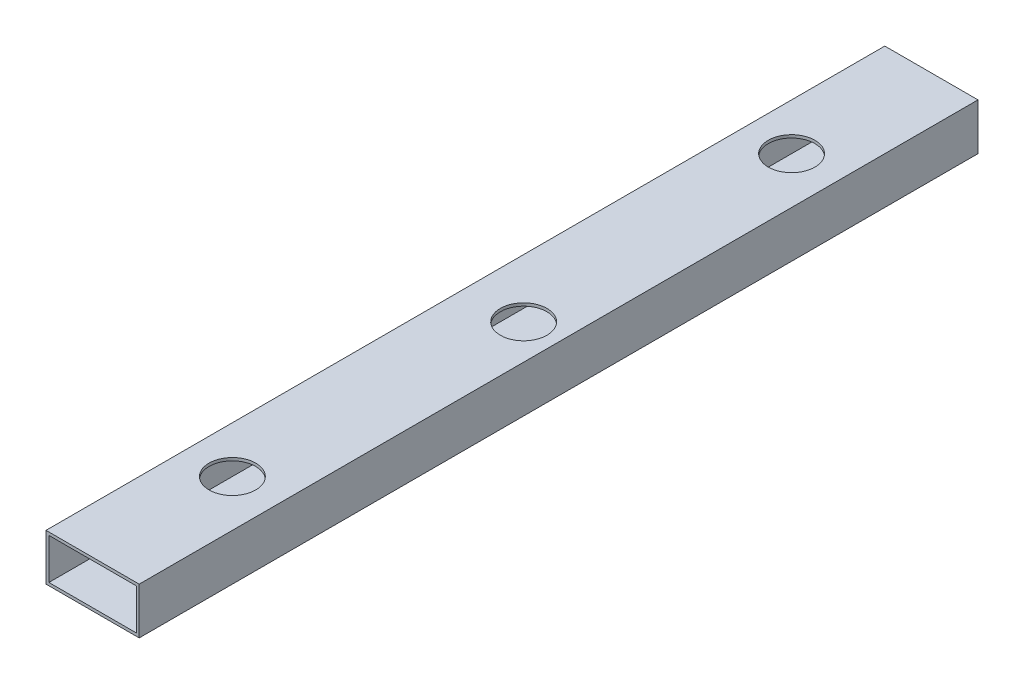
ISO-10303-21;
HEADER;
FILE_DESCRIPTION(('STEP AP214'),'2;1');
FILE_NAME('part.step','',(''),(''),'','','');
FILE_SCHEMA(('AUTOMOTIVE_DESIGN { 1 0 10303 214 1 1 1 1 }'));
ENDSEC;
DATA;
#1=APPLICATION_CONTEXT('core data for automotive mechanical design processes');
#2=APPLICATION_PROTOCOL_DEFINITION('international standard','automotive_design',2000,#1);
#3=PRODUCT_CONTEXT('',#1,'mechanical');
#4=PRODUCT('Part','Part','',(#3));
#5=PRODUCT_RELATED_PRODUCT_CATEGORY('part','',(#4));
#6=PRODUCT_DEFINITION_FORMATION('','',#4);
#7=PRODUCT_DEFINITION_CONTEXT('part definition',#1,'design');
#8=PRODUCT_DEFINITION('design','',#6,#7);
#9=PRODUCT_DEFINITION_SHAPE('','',#8);
#10=(LENGTH_UNIT() NAMED_UNIT(*) SI_UNIT(.MILLI.,.METRE.));
#11=(NAMED_UNIT(*) PLANE_ANGLE_UNIT() SI_UNIT($,.RADIAN.));
#12=(NAMED_UNIT(*) SI_UNIT($,.STERADIAN.) SOLID_ANGLE_UNIT());
#13=UNCERTAINTY_MEASURE_WITH_UNIT(LENGTH_MEASURE(1.E-05),#10,'distance_accuracy_value','');
#14=(GEOMETRIC_REPRESENTATION_CONTEXT(3) GLOBAL_UNCERTAINTY_ASSIGNED_CONTEXT((#13)) GLOBAL_UNIT_ASSIGNED_CONTEXT((#10,
#11,#12)) REPRESENTATION_CONTEXT('',''));
#15=CARTESIAN_POINT('',(0.,0.,0.));
#16=DIRECTION('',(0.,0.,1.));
#17=DIRECTION('',(1.,0.,0.));
#18=AXIS2_PLACEMENT_3D('',#15,#16,#17);
#19=CARTESIAN_POINT('',(0.,0.,457.2));
#20=DIRECTION('',(0.,0.,-1.));
#21=DIRECTION('',(-1.,0.,0.));
#22=AXIS2_PLACEMENT_3D('',#19,#20,#21);
#23=PLANE('',#22);
#24=DIRECTION('',(0.,-1.,0.));
#25=VECTOR('',#24,1.);
#26=CARTESIAN_POINT('',(0.,0.,457.2));
#27=LINE('',#26,#25);
#28=CARTESIAN_POINT('',(0.,25.4,457.2));
#29=VERTEX_POINT('',#28);
#30=CARTESIAN_POINT('',(0.,0.,457.2));
#31=VERTEX_POINT('',#30);
#32=EDGE_CURVE('E138',#29,#31,#27,.T.);
#33=ORIENTED_EDGE('',*,*,#32,.T.);
#34=DIRECTION('',(1.,0.,0.));
#35=VECTOR('',#34,1.);
#36=CARTESIAN_POINT('',(0.,0.,457.2));
#37=LINE('',#36,#35);
#38=CARTESIAN_POINT('',(50.8,0.,457.2));
#39=VERTEX_POINT('',#38);
#40=EDGE_CURVE('E141',#31,#39,#37,.T.);
#41=ORIENTED_EDGE('',*,*,#40,.T.);
#42=DIRECTION('',(0.,1.,0.));
#43=VECTOR('',#42,1.);
#44=CARTESIAN_POINT('',(50.8,0.,457.2));
#45=LINE('',#44,#43);
#46=CARTESIAN_POINT('',(50.8,25.4,457.2));
#47=VERTEX_POINT('',#46);
#48=EDGE_CURVE('E144',#39,#47,#45,.T.);
#49=ORIENTED_EDGE('',*,*,#48,.T.);
#50=DIRECTION('',(-1.,0.,0.));
#51=VECTOR('',#50,1.);
#52=CARTESIAN_POINT('',(0.,25.4,457.2));
#53=LINE('',#52,#51);
#54=EDGE_CURVE('E146',#47,#29,#53,.T.);
#55=ORIENTED_EDGE('',*,*,#54,.T.);
#56=EDGE_LOOP('',(#33,#41,#49,#55));
#57=FACE_BOUND('',#56,.T.);
#58=DIRECTION('',(0.,-1.,0.));
#59=VECTOR('',#58,1.);
#60=CARTESIAN_POINT('',(1.5875,1.5875,457.2));
#61=LINE('',#60,#59);
#62=CARTESIAN_POINT('',(1.5875,23.8125,457.2));
#63=VERTEX_POINT('',#62);
#64=CARTESIAN_POINT('',(1.5875,1.5875,457.2));
#65=VERTEX_POINT('',#64);
#66=EDGE_CURVE('E100',#63,#65,#61,.T.);
#67=ORIENTED_EDGE('',*,*,#66,.F.);
#68=DIRECTION('',(-1.,0.,0.));
#69=VECTOR('',#68,1.);
#70=CARTESIAN_POINT('',(1.5875,23.8125,457.2));
#71=LINE('',#70,#69);
#72=CARTESIAN_POINT('',(49.2125,23.8125,457.2));
#73=VERTEX_POINT('',#72);
#74=EDGE_CURVE('E122',#73,#63,#71,.T.);
#75=ORIENTED_EDGE('',*,*,#74,.F.);
#76=DIRECTION('',(0.,1.,0.));
#77=VECTOR('',#76,1.);
#78=CARTESIAN_POINT('',(49.2125,1.5875,457.2));
#79=LINE('',#78,#77);
#80=CARTESIAN_POINT('',(49.2125,1.5875,457.2));
#81=VERTEX_POINT('',#80);
#82=EDGE_CURVE('E120',#81,#73,#79,.T.);
#83=ORIENTED_EDGE('',*,*,#82,.F.);
#84=DIRECTION('',(1.,0.,0.));
#85=VECTOR('',#84,1.);
#86=CARTESIAN_POINT('',(1.5875,1.5875,457.2));
#87=LINE('',#86,#85);
#88=EDGE_CURVE('E108',#65,#81,#87,.T.);
#89=ORIENTED_EDGE('',*,*,#88,.F.);
#90=EDGE_LOOP('',(#67,#75,#83,#89));
#91=FACE_BOUND('',#90,.T.);
#92=ADVANCED_FACE('F33',(#57,#91),#23,.F.);
#93=CARTESIAN_POINT('',(0.,0.,0.));
#94=DIRECTION('',(0.,0.,-1.));
#95=DIRECTION('',(-1.,0.,0.));
#96=AXIS2_PLACEMENT_3D('',#93,#94,#95);
#97=PLANE('',#96);
#98=DIRECTION('',(0.,-1.,0.));
#99=VECTOR('',#98,1.);
#100=CARTESIAN_POINT('',(0.,0.,0.));
#101=LINE('',#100,#99);
#102=CARTESIAN_POINT('',(0.,25.4,0.));
#103=VERTEX_POINT('',#102);
#104=CARTESIAN_POINT('',(0.,0.,0.));
#105=VERTEX_POINT('',#104);
#106=EDGE_CURVE('E116',#103,#105,#101,.T.);
#107=ORIENTED_EDGE('',*,*,#106,.F.);
#108=DIRECTION('',(-1.,0.,0.));
#109=VECTOR('',#108,1.);
#110=CARTESIAN_POINT('',(0.,25.4,0.));
#111=LINE('',#110,#109);
#112=CARTESIAN_POINT('',(50.8,25.4,0.));
#113=VERTEX_POINT('',#112);
#114=EDGE_CURVE('E142',#113,#103,#111,.T.);
#115=ORIENTED_EDGE('',*,*,#114,.F.);
#116=DIRECTION('',(0.,1.,0.));
#117=VECTOR('',#116,1.);
#118=CARTESIAN_POINT('',(50.8,0.,0.));
#119=LINE('',#118,#117);
#120=CARTESIAN_POINT('',(50.8,0.,0.));
#121=VERTEX_POINT('',#120);
#122=EDGE_CURVE('E153',#121,#113,#119,.T.);
#123=ORIENTED_EDGE('',*,*,#122,.F.);
#124=DIRECTION('',(1.,0.,0.));
#125=VECTOR('',#124,1.);
#126=CARTESIAN_POINT('',(0.,0.,0.));
#127=LINE('',#126,#125);
#128=EDGE_CURVE('E151',#105,#121,#127,.T.);
#129=ORIENTED_EDGE('',*,*,#128,.F.);
#130=EDGE_LOOP('',(#107,#115,#123,#129));
#131=FACE_BOUND('',#130,.T.);
#132=DIRECTION('',(-1.,0.,0.));
#133=VECTOR('',#132,1.);
#134=CARTESIAN_POINT('',(1.5875,23.8125,0.));
#135=LINE('',#134,#133);
#136=CARTESIAN_POINT('',(49.2125,23.8125,0.));
#137=VERTEX_POINT('',#136);
#138=CARTESIAN_POINT('',(1.5875,23.8125,0.));
#139=VERTEX_POINT('',#138);
#140=EDGE_CURVE('E109',#137,#139,#135,.T.);
#141=ORIENTED_EDGE('',*,*,#140,.T.);
#142=DIRECTION('',(0.,-1.,0.));
#143=VECTOR('',#142,1.);
#144=CARTESIAN_POINT('',(1.5875,1.5875,0.));
#145=LINE('',#144,#143);
#146=CARTESIAN_POINT('',(1.5875,1.5875,0.));
#147=VERTEX_POINT('',#146);
#148=EDGE_CURVE('E58',#139,#147,#145,.T.);
#149=ORIENTED_EDGE('',*,*,#148,.T.);
#150=DIRECTION('',(1.,0.,0.));
#151=VECTOR('',#150,1.);
#152=CARTESIAN_POINT('',(1.5875,1.5875,0.));
#153=LINE('',#152,#151);
#154=CARTESIAN_POINT('',(49.2125,1.5875,0.));
#155=VERTEX_POINT('',#154);
#156=EDGE_CURVE('E115',#147,#155,#153,.T.);
#157=ORIENTED_EDGE('',*,*,#156,.T.);
#158=DIRECTION('',(0.,1.,0.));
#159=VECTOR('',#158,1.);
#160=CARTESIAN_POINT('',(49.2125,1.5875,0.));
#161=LINE('',#160,#159);
#162=EDGE_CURVE('E130',#155,#137,#161,.T.);
#163=ORIENTED_EDGE('',*,*,#162,.T.);
#164=EDGE_LOOP('',(#141,#149,#157,#163));
#165=FACE_BOUND('',#164,.T.);
#166=ADVANCED_FACE('F213',(#131,#165),#97,.T.);
#167=CARTESIAN_POINT('',(0.,0.,457.2));
#168=DIRECTION('',(1.,0.,0.));
#169=DIRECTION('',(0.,0.,-1.));
#170=AXIS2_PLACEMENT_3D('',#167,#168,#169);
#171=PLANE('',#170);
#172=ORIENTED_EDGE('',*,*,#106,.T.);
#173=DIRECTION('',(0.,0.,-1.));
#174=VECTOR('',#173,1.);
#175=CARTESIAN_POINT('',(0.,0.,457.2));
#176=LINE('',#175,#174);
#177=EDGE_CURVE('E11',#31,#105,#176,.T.);
#178=ORIENTED_EDGE('',*,*,#177,.F.);
#179=ORIENTED_EDGE('',*,*,#32,.F.);
#180=DIRECTION('',(0.,0.,-1.));
#181=VECTOR('',#180,1.);
#182=CARTESIAN_POINT('',(0.,25.4,457.2));
#183=LINE('',#182,#181);
#184=EDGE_CURVE('E148',#29,#103,#183,.T.);
#185=ORIENTED_EDGE('',*,*,#184,.T.);
#186=EDGE_LOOP('',(#172,#178,#179,#185));
#187=FACE_BOUND('',#186,.T.);
#188=ADVANCED_FACE('F35',(#187),#171,.F.);
#189=CARTESIAN_POINT('',(0.,0.,457.2));
#190=DIRECTION('',(0.,1.,0.));
#191=DIRECTION('',(0.,0.,1.));
#192=AXIS2_PLACEMENT_3D('',#189,#190,#191);
#193=PLANE('',#192);
#194=CARTESIAN_POINT('',(31.75,0.,228.6));
#195=DIRECTION('',(0.,1.,0.));
#196=DIRECTION('',(0.,0.,1.));
#197=AXIS2_PLACEMENT_3D('',#194,#195,#196);
#198=CIRCLE('',#197,12.7);
#199=CARTESIAN_POINT('',(31.75,0.,241.3));
#200=VERTEX_POINT('',#199);
#201=EDGE_CURVE('E237',#200,#200,#198,.T.);
#202=ORIENTED_EDGE('',*,*,#201,.T.);
#203=EDGE_LOOP('',(#202));
#204=FACE_BOUND('',#203,.T.);
#205=CARTESIAN_POINT('',(25.4,0.,76.2));
#206=DIRECTION('',(0.,1.,0.));
#207=DIRECTION('',(0.,0.,1.));
#208=AXIS2_PLACEMENT_3D('',#205,#206,#207);
#209=CIRCLE('',#208,12.7);
#210=CARTESIAN_POINT('',(25.4,0.,88.9));
#211=VERTEX_POINT('',#210);
#212=EDGE_CURVE('E169',#211,#211,#209,.T.);
#213=ORIENTED_EDGE('',*,*,#212,.T.);
#214=EDGE_LOOP('',(#213));
#215=FACE_BOUND('',#214,.T.);
#216=CARTESIAN_POINT('',(25.4,0.,381.));
#217=DIRECTION('',(0.,1.,0.));
#218=DIRECTION('',(0.,0.,1.));
#219=AXIS2_PLACEMENT_3D('',#216,#217,#218);
#220=CIRCLE('',#219,12.7);
#221=CARTESIAN_POINT('',(25.4,0.,393.7));
#222=VERTEX_POINT('',#221);
#223=EDGE_CURVE('E165',#222,#222,#220,.T.);
#224=ORIENTED_EDGE('',*,*,#223,.T.);
#225=EDGE_LOOP('',(#224));
#226=FACE_BOUND('',#225,.T.);
#227=ORIENTED_EDGE('',*,*,#128,.T.);
#228=DIRECTION('',(0.,0.,-1.));
#229=VECTOR('',#228,1.);
#230=CARTESIAN_POINT('',(50.8,0.,457.2));
#231=LINE('',#230,#229);
#232=EDGE_CURVE('E42',#39,#121,#231,.T.);
#233=ORIENTED_EDGE('',*,*,#232,.F.);
#234=ORIENTED_EDGE('',*,*,#40,.F.);
#235=ORIENTED_EDGE('',*,*,#177,.T.);
#236=EDGE_LOOP('',(#227,#233,#234,#235));
#237=FACE_BOUND('',#236,.T.);
#238=ADVANCED_FACE('F226',(#204,#215,#226,#237),#193,.F.);
#239=CARTESIAN_POINT('',(50.8,0.,457.2));
#240=DIRECTION('',(-1.,0.,0.));
#241=DIRECTION('',(0.,0.,1.));
#242=AXIS2_PLACEMENT_3D('',#239,#240,#241);
#243=PLANE('',#242);
#244=ORIENTED_EDGE('',*,*,#122,.T.);
#245=DIRECTION('',(0.,0.,-1.));
#246=VECTOR('',#245,1.);
#247=CARTESIAN_POINT('',(50.8,25.4,457.2));
#248=LINE('',#247,#246);
#249=EDGE_CURVE('E158',#47,#113,#248,.T.);
#250=ORIENTED_EDGE('',*,*,#249,.F.);
#251=ORIENTED_EDGE('',*,*,#48,.F.);
#252=ORIENTED_EDGE('',*,*,#232,.T.);
#253=EDGE_LOOP('',(#244,#250,#251,#252));
#254=FACE_BOUND('',#253,.T.);
#255=ADVANCED_FACE('F223',(#254),#243,.F.);
#256=CARTESIAN_POINT('',(0.,25.4,457.2));
#257=DIRECTION('',(0.,-1.,0.));
#258=DIRECTION('',(0.,0.,-1.));
#259=AXIS2_PLACEMENT_3D('',#256,#257,#258);
#260=PLANE('',#259);
#261=CARTESIAN_POINT('',(31.75,25.4,228.6));
#262=DIRECTION('',(0.,1.,0.));
#263=DIRECTION('',(0.,0.,1.));
#264=AXIS2_PLACEMENT_3D('',#261,#262,#263);
#265=CIRCLE('',#264,12.7);
#266=CARTESIAN_POINT('',(31.75,25.4,241.3));
#267=VERTEX_POINT('',#266);
#268=EDGE_CURVE('E283',#267,#267,#265,.T.);
#269=ORIENTED_EDGE('',*,*,#268,.F.);
#270=EDGE_LOOP('',(#269));
#271=FACE_BOUND('',#270,.T.);
#272=CARTESIAN_POINT('',(25.4,25.4,76.2));
#273=DIRECTION('',(0.,1.,0.));
#274=DIRECTION('',(0.,0.,1.));
#275=AXIS2_PLACEMENT_3D('',#272,#273,#274);
#276=CIRCLE('',#275,12.7);
#277=CARTESIAN_POINT('',(25.4,25.4,88.9));
#278=VERTEX_POINT('',#277);
#279=EDGE_CURVE('E176',#278,#278,#276,.T.);
#280=ORIENTED_EDGE('',*,*,#279,.F.);
#281=EDGE_LOOP('',(#280));
#282=FACE_BOUND('',#281,.T.);
#283=CARTESIAN_POINT('',(25.4,25.4,381.));
#284=DIRECTION('',(0.,1.,0.));
#285=DIRECTION('',(0.,0.,1.));
#286=AXIS2_PLACEMENT_3D('',#283,#284,#285);
#287=CIRCLE('',#286,12.7);
#288=CARTESIAN_POINT('',(25.4,25.4,393.7));
#289=VERTEX_POINT('',#288);
#290=EDGE_CURVE('E173',#289,#289,#287,.T.);
#291=ORIENTED_EDGE('',*,*,#290,.F.);
#292=EDGE_LOOP('',(#291));
#293=FACE_BOUND('',#292,.T.);
#294=ORIENTED_EDGE('',*,*,#114,.T.);
#295=ORIENTED_EDGE('',*,*,#184,.F.);
#296=ORIENTED_EDGE('',*,*,#54,.F.);
#297=ORIENTED_EDGE('',*,*,#249,.T.);
#298=EDGE_LOOP('',(#294,#295,#296,#297));
#299=FACE_BOUND('',#298,.T.);
#300=ADVANCED_FACE('F208',(#271,#282,#293,#299),#260,.F.);
#301=CARTESIAN_POINT('',(1.5875,1.5875,457.2));
#302=DIRECTION('',(1.,0.,0.));
#303=DIRECTION('',(0.,0.,-1.));
#304=AXIS2_PLACEMENT_3D('',#301,#302,#303);
#305=PLANE('',#304);
#306=ORIENTED_EDGE('',*,*,#148,.F.);
#307=DIRECTION('',(0.,0.,-1.));
#308=VECTOR('',#307,1.);
#309=CARTESIAN_POINT('',(1.5875,23.8125,457.2));
#310=LINE('',#309,#308);
#311=EDGE_CURVE('E104',#63,#139,#310,.T.);
#312=ORIENTED_EDGE('',*,*,#311,.F.);
#313=ORIENTED_EDGE('',*,*,#66,.T.);
#314=DIRECTION('',(0.,0.,-1.));
#315=VECTOR('',#314,1.);
#316=CARTESIAN_POINT('',(1.5875,1.5875,457.2));
#317=LINE('',#316,#315);
#318=EDGE_CURVE('E103',#65,#147,#317,.T.);
#319=ORIENTED_EDGE('',*,*,#318,.T.);
#320=EDGE_LOOP('',(#306,#312,#313,#319));
#321=FACE_BOUND('',#320,.T.);
#322=ADVANCED_FACE('F102',(#321),#305,.T.);
#323=CARTESIAN_POINT('',(1.5875,1.5875,457.2));
#324=DIRECTION('',(0.,1.,0.));
#325=DIRECTION('',(0.,0.,1.));
#326=AXIS2_PLACEMENT_3D('',#323,#324,#325);
#327=PLANE('',#326);
#328=CARTESIAN_POINT('',(31.75,1.5875,228.6));
#329=DIRECTION('',(0.,1.,0.));
#330=DIRECTION('',(0.,0.,1.));
#331=AXIS2_PLACEMENT_3D('',#328,#329,#330);
#332=CIRCLE('',#331,12.7);
#333=CARTESIAN_POINT('',(31.75,1.5875,241.3));
#334=VERTEX_POINT('',#333);
#335=EDGE_CURVE('E181',#334,#334,#332,.T.);
#336=ORIENTED_EDGE('',*,*,#335,.F.);
#337=EDGE_LOOP('',(#336));
#338=FACE_BOUND('',#337,.T.);
#339=CARTESIAN_POINT('',(25.4,1.5875,76.2));
#340=DIRECTION('',(0.,1.,0.));
#341=DIRECTION('',(0.,0.,1.));
#342=AXIS2_PLACEMENT_3D('',#339,#340,#341);
#343=CIRCLE('',#342,12.7);
#344=CARTESIAN_POINT('',(25.4,1.5875,88.9));
#345=VERTEX_POINT('',#344);
#346=EDGE_CURVE('E168',#345,#345,#343,.T.);
#347=ORIENTED_EDGE('',*,*,#346,.F.);
#348=EDGE_LOOP('',(#347));
#349=FACE_BOUND('',#348,.T.);
#350=CARTESIAN_POINT('',(25.4,1.5875,381.));
#351=DIRECTION('',(0.,1.,0.));
#352=DIRECTION('',(0.,0.,1.));
#353=AXIS2_PLACEMENT_3D('',#350,#351,#352);
#354=CIRCLE('',#353,12.7);
#355=CARTESIAN_POINT('',(25.4,1.5875,393.7));
#356=VERTEX_POINT('',#355);
#357=EDGE_CURVE('E128',#356,#356,#354,.T.);
#358=ORIENTED_EDGE('',*,*,#357,.F.);
#359=EDGE_LOOP('',(#358));
#360=FACE_BOUND('',#359,.T.);
#361=ORIENTED_EDGE('',*,*,#156,.F.);
#362=ORIENTED_EDGE('',*,*,#318,.F.);
#363=ORIENTED_EDGE('',*,*,#88,.T.);
#364=DIRECTION('',(0.,0.,-1.));
#365=VECTOR('',#364,1.);
#366=CARTESIAN_POINT('',(49.2125,1.5875,457.2));
#367=LINE('',#366,#365);
#368=EDGE_CURVE('E117',#81,#155,#367,.T.);
#369=ORIENTED_EDGE('',*,*,#368,.T.);
#370=EDGE_LOOP('',(#361,#362,#363,#369));
#371=FACE_BOUND('',#370,.T.);
#372=ADVANCED_FACE('F112',(#338,#349,#360,#371),#327,.T.);
#373=CARTESIAN_POINT('',(49.2125,1.5875,457.2));
#374=DIRECTION('',(-1.,0.,0.));
#375=DIRECTION('',(0.,0.,1.));
#376=AXIS2_PLACEMENT_3D('',#373,#374,#375);
#377=PLANE('',#376);
#378=ORIENTED_EDGE('',*,*,#162,.F.);
#379=ORIENTED_EDGE('',*,*,#368,.F.);
#380=ORIENTED_EDGE('',*,*,#82,.T.);
#381=DIRECTION('',(0.,0.,-1.));
#382=VECTOR('',#381,1.);
#383=CARTESIAN_POINT('',(49.2125,23.8125,457.2));
#384=LINE('',#383,#382);
#385=EDGE_CURVE('E50',#73,#137,#384,.T.);
#386=ORIENTED_EDGE('',*,*,#385,.T.);
#387=EDGE_LOOP('',(#378,#379,#380,#386));
#388=FACE_BOUND('',#387,.T.);
#389=ADVANCED_FACE('F196',(#388),#377,.T.);
#390=CARTESIAN_POINT('',(1.5875,23.8125,457.2));
#391=DIRECTION('',(0.,-1.,0.));
#392=DIRECTION('',(0.,0.,-1.));
#393=AXIS2_PLACEMENT_3D('',#390,#391,#392);
#394=PLANE('',#393);
#395=CARTESIAN_POINT('',(31.75,23.8125,228.6));
#396=DIRECTION('',(0.,-1.,0.));
#397=DIRECTION('',(0.,0.,-1.));
#398=AXIS2_PLACEMENT_3D('',#395,#396,#397);
#399=CIRCLE('',#398,12.7);
#400=CARTESIAN_POINT('',(31.75,23.8125,215.9));
#401=VERTEX_POINT('',#400);
#402=EDGE_CURVE('E37',#401,#401,#399,.T.);
#403=ORIENTED_EDGE('',*,*,#402,.F.);
#404=EDGE_LOOP('',(#403));
#405=FACE_BOUND('',#404,.T.);
#406=CARTESIAN_POINT('',(25.4,23.8125,76.2));
#407=DIRECTION('',(0.,-1.,0.));
#408=DIRECTION('',(0.,0.,-1.));
#409=AXIS2_PLACEMENT_3D('',#406,#407,#408);
#410=CIRCLE('',#409,12.7);
#411=CARTESIAN_POINT('',(25.4,23.8125,63.5));
#412=VERTEX_POINT('',#411);
#413=EDGE_CURVE('E166',#412,#412,#410,.T.);
#414=ORIENTED_EDGE('',*,*,#413,.F.);
#415=EDGE_LOOP('',(#414));
#416=FACE_BOUND('',#415,.T.);
#417=CARTESIAN_POINT('',(25.4,23.8125,381.));
#418=DIRECTION('',(0.,-1.,0.));
#419=DIRECTION('',(0.,0.,-1.));
#420=AXIS2_PLACEMENT_3D('',#417,#418,#419);
#421=CIRCLE('',#420,12.7);
#422=CARTESIAN_POINT('',(25.4,23.8125,368.3));
#423=VERTEX_POINT('',#422);
#424=EDGE_CURVE('E163',#423,#423,#421,.T.);
#425=ORIENTED_EDGE('',*,*,#424,.F.);
#426=EDGE_LOOP('',(#425));
#427=FACE_BOUND('',#426,.T.);
#428=ORIENTED_EDGE('',*,*,#140,.F.);
#429=ORIENTED_EDGE('',*,*,#385,.F.);
#430=ORIENTED_EDGE('',*,*,#74,.T.);
#431=ORIENTED_EDGE('',*,*,#311,.T.);
#432=EDGE_LOOP('',(#428,#429,#430,#431));
#433=FACE_BOUND('',#432,.T.);
#434=ADVANCED_FACE('F204',(#405,#416,#427,#433),#394,.T.);
#435=CARTESIAN_POINT('',(25.4,0.,381.));
#436=DIRECTION('',(0.,1.,0.));
#437=DIRECTION('',(0.,0.,1.));
#438=AXIS2_PLACEMENT_3D('',#435,#436,#437);
#439=CYLINDRICAL_SURFACE('',#438,12.7);
#440=ORIENTED_EDGE('',*,*,#424,.T.);
#441=EDGE_LOOP('',(#440));
#442=FACE_BOUND('',#441,.T.);
#443=ORIENTED_EDGE('',*,*,#290,.T.);
#444=EDGE_LOOP('',(#443));
#445=FACE_BOUND('',#444,.T.);
#446=ADVANCED_FACE('F254',(#442,#445),#439,.F.);
#447=ORIENTED_EDGE('',*,*,#357,.T.);
#448=EDGE_LOOP('',(#447));
#449=FACE_BOUND('',#448,.T.);
#450=ORIENTED_EDGE('',*,*,#223,.F.);
#451=EDGE_LOOP('',(#450));
#452=FACE_BOUND('',#451,.T.);
#453=ADVANCED_FACE('F192',(#449,#452),#439,.F.);
#454=CARTESIAN_POINT('',(25.4,0.,76.2));
#455=DIRECTION('',(0.,1.,0.));
#456=DIRECTION('',(0.,0.,1.));
#457=AXIS2_PLACEMENT_3D('',#454,#455,#456);
#458=CYLINDRICAL_SURFACE('',#457,12.7);
#459=ORIENTED_EDGE('',*,*,#413,.T.);
#460=EDGE_LOOP('',(#459));
#461=FACE_BOUND('',#460,.T.);
#462=ORIENTED_EDGE('',*,*,#279,.T.);
#463=EDGE_LOOP('',(#462));
#464=FACE_BOUND('',#463,.T.);
#465=ADVANCED_FACE('F266',(#461,#464),#458,.F.);
#466=ORIENTED_EDGE('',*,*,#346,.T.);
#467=EDGE_LOOP('',(#466));
#468=FACE_BOUND('',#467,.T.);
#469=ORIENTED_EDGE('',*,*,#212,.F.);
#470=EDGE_LOOP('',(#469));
#471=FACE_BOUND('',#470,.T.);
#472=ADVANCED_FACE('F269',(#468,#471),#458,.F.);
#473=CARTESIAN_POINT('',(31.75,0.,228.6));
#474=DIRECTION('',(0.,1.,0.));
#475=DIRECTION('',(0.,0.,1.));
#476=AXIS2_PLACEMENT_3D('',#473,#474,#475);
#477=CYLINDRICAL_SURFACE('',#476,12.7);
#478=ORIENTED_EDGE('',*,*,#402,.T.);
#479=EDGE_LOOP('',(#478));
#480=FACE_BOUND('',#479,.T.);
#481=ORIENTED_EDGE('',*,*,#268,.T.);
#482=EDGE_LOOP('',(#481));
#483=FACE_BOUND('',#482,.T.);
#484=ADVANCED_FACE('F270',(#480,#483),#477,.F.);
#485=ORIENTED_EDGE('',*,*,#335,.T.);
#486=EDGE_LOOP('',(#485));
#487=FACE_BOUND('',#486,.T.);
#488=ORIENTED_EDGE('',*,*,#201,.F.);
#489=EDGE_LOOP('',(#488));
#490=FACE_BOUND('',#489,.T.);
#491=ADVANCED_FACE('F272',(#487,#490),#477,.F.);
#492=CLOSED_SHELL('',(#92,#166,#188,#238,#255,#300,#322,#372,#389,#434,#446,#453,#465,#472,#484,#491));
#493=MANIFOLD_SOLID_BREP('B2',#492);
#494=ADVANCED_BREP_SHAPE_REPRESENTATION('',(#18,#493),#14);
#495=SHAPE_DEFINITION_REPRESENTATION(#9,#494);
ENDSEC;
END-ISO-10303-21;
